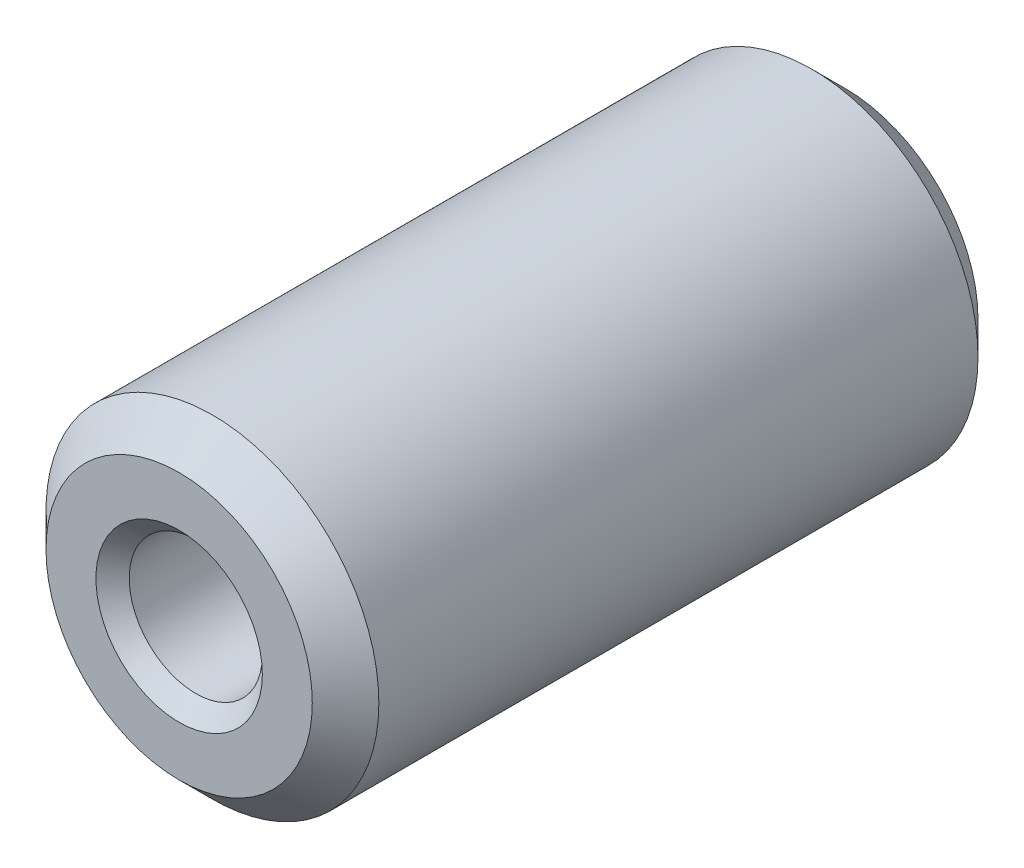
ISO-10303-21;
HEADER;
FILE_DESCRIPTION(('STEP AP214'),'2;1');
FILE_NAME('part.step','',(''),(''),'','','');
FILE_SCHEMA(('AUTOMOTIVE_DESIGN { 1 0 10303 214 1 1 1 1 }'));
ENDSEC;
DATA;
#1=APPLICATION_CONTEXT('core data for automotive mechanical design processes');
#2=APPLICATION_PROTOCOL_DEFINITION('international standard','automotive_design',2000,#1);
#3=PRODUCT_CONTEXT('',#1,'mechanical');
#4=PRODUCT('Part','Part','',(#3));
#5=PRODUCT_RELATED_PRODUCT_CATEGORY('part','',(#4));
#6=PRODUCT_DEFINITION_FORMATION('','',#4);
#7=PRODUCT_DEFINITION_CONTEXT('part definition',#1,'design');
#8=PRODUCT_DEFINITION('design','',#6,#7);
#9=PRODUCT_DEFINITION_SHAPE('','',#8);
#10=(LENGTH_UNIT() NAMED_UNIT(*) SI_UNIT(.MILLI.,.METRE.));
#11=(NAMED_UNIT(*) PLANE_ANGLE_UNIT() SI_UNIT($,.RADIAN.));
#12=(NAMED_UNIT(*) SI_UNIT($,.STERADIAN.) SOLID_ANGLE_UNIT());
#13=UNCERTAINTY_MEASURE_WITH_UNIT(LENGTH_MEASURE(1.E-05),#10,'distance_accuracy_value','');
#14=(GEOMETRIC_REPRESENTATION_CONTEXT(3) GLOBAL_UNCERTAINTY_ASSIGNED_CONTEXT((#13)) GLOBAL_UNIT_ASSIGNED_CONTEXT((#10,
#11,#12)) REPRESENTATION_CONTEXT('',''));
#15=CARTESIAN_POINT('',(0.,0.,0.));
#16=DIRECTION('',(0.,0.,1.));
#17=DIRECTION('',(1.,0.,0.));
#18=AXIS2_PLACEMENT_3D('',#15,#16,#17);
#19=CARTESIAN_POINT('',(0.,0.,20.));
#20=DIRECTION('',(0.,0.,1.));
#21=DIRECTION('',(1.,0.,0.));
#22=AXIS2_PLACEMENT_3D('',#19,#20,#21);
#23=PLANE('',#22);
#24=CARTESIAN_POINT('',(0.,0.,20.));
#25=DIRECTION('',(0.,0.,1.));
#26=DIRECTION('',(1.,0.,0.));
#27=AXIS2_PLACEMENT_3D('',#24,#25,#26);
#28=CIRCLE('',#27,2.5);
#29=CARTESIAN_POINT('',(2.5,0.,20.));
#30=VERTEX_POINT('',#29);
#31=EDGE_CURVE('E37',#30,#30,#28,.F.);
#32=ORIENTED_EDGE('',*,*,#31,.T.);
#33=EDGE_LOOP('',(#32));
#34=FACE_BOUND('',#33,.T.);
#35=CARTESIAN_POINT('',(0.,0.,20.));
#36=DIRECTION('',(0.,0.,1.));
#37=DIRECTION('',(1.,0.,0.));
#38=AXIS2_PLACEMENT_3D('',#35,#36,#37);
#39=CIRCLE('',#38,3.99999999999998);
#40=CARTESIAN_POINT('',(3.99999999999998,0.,20.));
#41=VERTEX_POINT('',#40);
#42=EDGE_CURVE('E59',#41,#41,#39,.T.);
#43=ORIENTED_EDGE('',*,*,#42,.T.);
#44=EDGE_LOOP('',(#43));
#45=FACE_BOUND('',#44,.T.);
#46=ADVANCED_FACE('F30',(#34,#45),#23,.T.);
#47=CARTESIAN_POINT('',(0.,0.,0.));
#48=DIRECTION('',(0.,0.,1.));
#49=DIRECTION('',(1.,0.,0.));
#50=AXIS2_PLACEMENT_3D('',#47,#48,#49);
#51=PLANE('',#50);
#52=CARTESIAN_POINT('',(0.,0.,0.));
#53=DIRECTION('',(0.,0.,1.));
#54=DIRECTION('',(1.,0.,0.));
#55=AXIS2_PLACEMENT_3D('',#52,#53,#54);
#56=CIRCLE('',#55,2.50000000000001);
#57=CARTESIAN_POINT('',(2.50000000000001,0.,0.));
#58=VERTEX_POINT('',#57);
#59=EDGE_CURVE('E10',#58,#58,#56,.T.);
#60=ORIENTED_EDGE('',*,*,#59,.T.);
#61=EDGE_LOOP('',(#60));
#62=FACE_BOUND('',#61,.T.);
#63=CARTESIAN_POINT('',(0.,0.,0.));
#64=DIRECTION('',(0.,0.,1.));
#65=DIRECTION('',(1.,0.,0.));
#66=AXIS2_PLACEMENT_3D('',#63,#64,#65);
#67=CIRCLE('',#66,3.99999999999999);
#68=CARTESIAN_POINT('',(3.99999999999999,0.,0.));
#69=VERTEX_POINT('',#68);
#70=EDGE_CURVE('E50',#69,#69,#67,.F.);
#71=ORIENTED_EDGE('',*,*,#70,.T.);
#72=EDGE_LOOP('',(#71));
#73=FACE_BOUND('',#72,.T.);
#74=ADVANCED_FACE('F81',(#62,#73),#51,.F.);
#75=CARTESIAN_POINT('',(0.,0.,20.));
#76=DIRECTION('',(0.,0.,-1.));
#77=DIRECTION('',(-1.,0.,0.));
#78=AXIS2_PLACEMENT_3D('',#75,#76,#77);
#79=CYLINDRICAL_SURFACE('',#78,5.);
#80=CARTESIAN_POINT('',(0.,0.,19.));
#81=DIRECTION('',(0.,0.,1.));
#82=DIRECTION('',(1.,0.,0.));
#83=AXIS2_PLACEMENT_3D('',#80,#81,#82);
#84=CIRCLE('',#83,5.);
#85=CARTESIAN_POINT('',(5.,0.,19.));
#86=VERTEX_POINT('',#85);
#87=EDGE_CURVE('E53',#86,#86,#84,.F.);
#88=ORIENTED_EDGE('',*,*,#87,.T.);
#89=EDGE_LOOP('',(#88));
#90=FACE_BOUND('',#89,.T.);
#91=CARTESIAN_POINT('',(0.,0.,1.00000000000001));
#92=DIRECTION('',(0.,0.,1.));
#93=DIRECTION('',(1.,0.,0.));
#94=AXIS2_PLACEMENT_3D('',#91,#92,#93);
#95=CIRCLE('',#94,5.);
#96=CARTESIAN_POINT('',(5.,0.,1.00000000000001));
#97=VERTEX_POINT('',#96);
#98=EDGE_CURVE('E56',#97,#97,#95,.T.);
#99=ORIENTED_EDGE('',*,*,#98,.T.);
#100=EDGE_LOOP('',(#99));
#101=FACE_BOUND('',#100,.T.);
#102=ADVANCED_FACE('F32',(#90,#101),#79,.T.);
#103=CARTESIAN_POINT('',(0.,0.,20.));
#104=DIRECTION('',(0.,0.,-1.));
#105=DIRECTION('',(-1.,0.,0.));
#106=AXIS2_PLACEMENT_3D('',#103,#104,#105);
#107=CYLINDRICAL_SURFACE('',#106,2.);
#108=CARTESIAN_POINT('',(0.,0.,19.5));
#109=DIRECTION('',(0.,0.,1.));
#110=DIRECTION('',(1.,0.,0.));
#111=AXIS2_PLACEMENT_3D('',#108,#109,#110);
#112=CIRCLE('',#111,2.);
#113=CARTESIAN_POINT('',(2.,0.,19.5));
#114=VERTEX_POINT('',#113);
#115=EDGE_CURVE('E41',#114,#114,#112,.T.);
#116=ORIENTED_EDGE('',*,*,#115,.T.);
#117=EDGE_LOOP('',(#116));
#118=FACE_BOUND('',#117,.T.);
#119=CARTESIAN_POINT('',(0.,0.,0.5));
#120=DIRECTION('',(0.,0.,1.));
#121=DIRECTION('',(1.,0.,0.));
#122=AXIS2_PLACEMENT_3D('',#119,#120,#121);
#123=CIRCLE('',#122,2.);
#124=CARTESIAN_POINT('',(2.,0.,0.5));
#125=VERTEX_POINT('',#124);
#126=EDGE_CURVE('E45',#125,#125,#123,.F.);
#127=ORIENTED_EDGE('',*,*,#126,.T.);
#128=EDGE_LOOP('',(#127));
#129=FACE_BOUND('',#128,.T.);
#130=ADVANCED_FACE('F67',(#118,#129),#107,.F.);
#131=CARTESIAN_POINT('',(0.,0.,20.));
#132=DIRECTION('',(0.,0.,-1.));
#133=DIRECTION('',(-1.,0.,0.));
#134=AXIS2_PLACEMENT_3D('',#131,#132,#133);
#135=CONICAL_SURFACE('',#134,3.99999999999998,0.785398163397453);
#136=ORIENTED_EDGE('',*,*,#87,.F.);
#137=EDGE_LOOP('',(#136));
#138=FACE_BOUND('',#137,.T.);
#139=ORIENTED_EDGE('',*,*,#42,.F.);
#140=EDGE_LOOP('',(#139));
#141=FACE_BOUND('',#140,.T.);
#142=ADVANCED_FACE('F64',(#138,#141),#135,.T.);
#143=CARTESIAN_POINT('',(0.,0.,1.00000000000001));
#144=DIRECTION('',(0.,0.,1.));
#145=DIRECTION('',(1.,0.,0.));
#146=AXIS2_PLACEMENT_3D('',#143,#144,#145);
#147=CONICAL_SURFACE('',#146,5.,0.785398163397443);
#148=ORIENTED_EDGE('',*,*,#70,.F.);
#149=EDGE_LOOP('',(#148));
#150=FACE_BOUND('',#149,.T.);
#151=ORIENTED_EDGE('',*,*,#98,.F.);
#152=EDGE_LOOP('',(#151));
#153=FACE_BOUND('',#152,.T.);
#154=ADVANCED_FACE('F66',(#150,#153),#147,.T.);
#155=CARTESIAN_POINT('',(0.,0.,19.5));
#156=DIRECTION('',(0.,0.,1.));
#157=DIRECTION('',(1.,0.,0.));
#158=AXIS2_PLACEMENT_3D('',#155,#156,#157);
#159=CONICAL_SURFACE('',#158,2.,0.785398163397445);
#160=ORIENTED_EDGE('',*,*,#31,.F.);
#161=EDGE_LOOP('',(#160));
#162=FACE_BOUND('',#161,.T.);
#163=ORIENTED_EDGE('',*,*,#115,.F.);
#164=EDGE_LOOP('',(#163));
#165=FACE_BOUND('',#164,.T.);
#166=ADVANCED_FACE('F74',(#162,#165),#159,.F.);
#167=CARTESIAN_POINT('',(0.,0.,0.));
#168=DIRECTION('',(0.,0.,-1.));
#169=DIRECTION('',(-1.,0.,0.));
#170=AXIS2_PLACEMENT_3D('',#167,#168,#169);
#171=CONICAL_SURFACE('',#170,2.50000000000001,0.785398163397453);
#172=ORIENTED_EDGE('',*,*,#126,.F.);
#173=EDGE_LOOP('',(#172));
#174=FACE_BOUND('',#173,.T.);
#175=ORIENTED_EDGE('',*,*,#59,.F.);
#176=EDGE_LOOP('',(#175));
#177=FACE_BOUND('',#176,.T.);
#178=ADVANCED_FACE('F120',(#174,#177),#171,.F.);
#179=CLOSED_SHELL('',(#46,#74,#102,#130,#142,#154,#166,#178));
#180=MANIFOLD_SOLID_BREP('B2',#179);
#181=ADVANCED_BREP_SHAPE_REPRESENTATION('',(#18,#180),#14);
#182=SHAPE_DEFINITION_REPRESENTATION(#9,#181);
ENDSEC;
END-ISO-10303-21;
